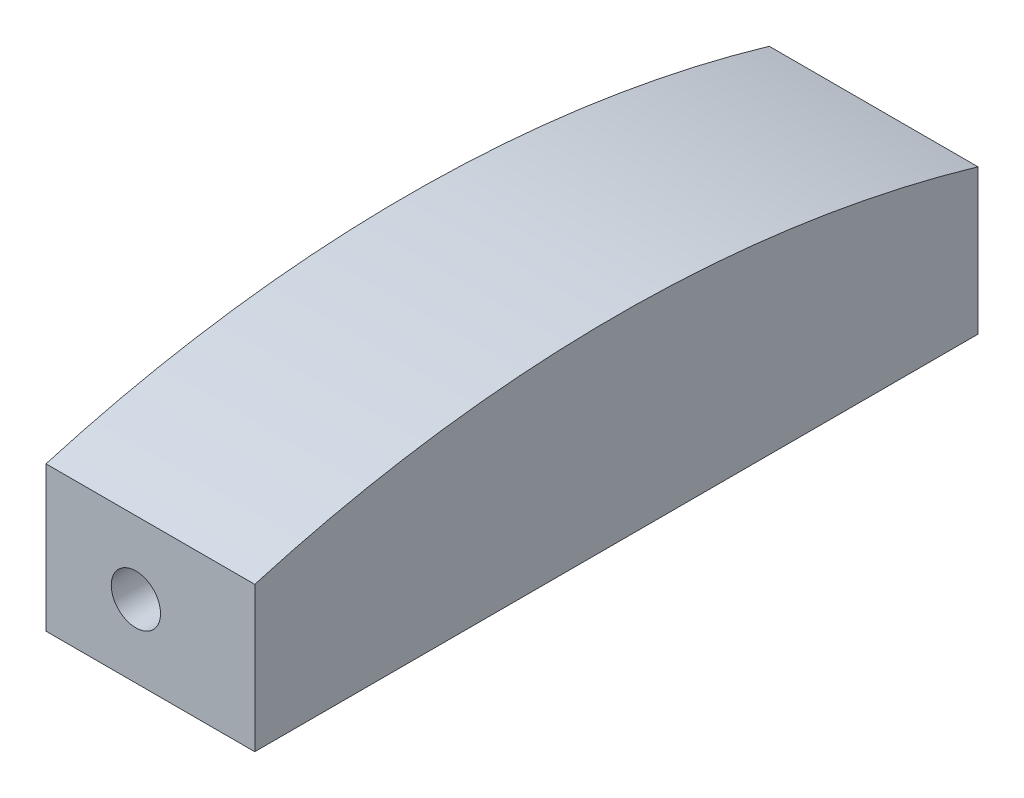
ISO-10303-21;
HEADER;
FILE_DESCRIPTION(('STEP AP214'),'2;1');
FILE_NAME('part.step','',(''),(''),'','','');
FILE_SCHEMA(('AUTOMOTIVE_DESIGN { 1 0 10303 214 1 1 1 1 }'));
ENDSEC;
DATA;
#1=APPLICATION_CONTEXT('core data for automotive mechanical design processes');
#2=APPLICATION_PROTOCOL_DEFINITION('international standard','automotive_design',2000,#1);
#3=PRODUCT_CONTEXT('',#1,'mechanical');
#4=PRODUCT('Part','Part','',(#3));
#5=PRODUCT_RELATED_PRODUCT_CATEGORY('part','',(#4));
#6=PRODUCT_DEFINITION_FORMATION('','',#4);
#7=PRODUCT_DEFINITION_CONTEXT('part definition',#1,'design');
#8=PRODUCT_DEFINITION('design','',#6,#7);
#9=PRODUCT_DEFINITION_SHAPE('','',#8);
#10=(LENGTH_UNIT() NAMED_UNIT(*) SI_UNIT(.MILLI.,.METRE.));
#11=(NAMED_UNIT(*) PLANE_ANGLE_UNIT() SI_UNIT($,.RADIAN.));
#12=(NAMED_UNIT(*) SI_UNIT($,.STERADIAN.) SOLID_ANGLE_UNIT());
#13=UNCERTAINTY_MEASURE_WITH_UNIT(LENGTH_MEASURE(1.E-05),#10,'distance_accuracy_value','');
#14=(GEOMETRIC_REPRESENTATION_CONTEXT(3) GLOBAL_UNCERTAINTY_ASSIGNED_CONTEXT((#13)) GLOBAL_UNIT_ASSIGNED_CONTEXT((#10,
#11,#12)) REPRESENTATION_CONTEXT('',''));
#15=CARTESIAN_POINT('',(0.,0.,0.));
#16=DIRECTION('',(0.,0.,1.));
#17=DIRECTION('',(1.,0.,0.));
#18=AXIS2_PLACEMENT_3D('',#15,#16,#17);
#19=CARTESIAN_POINT('',(0.,0.,0.));
#20=DIRECTION('',(0.,-1.,0.));
#21=DIRECTION('',(0.,0.,-1.));
#22=AXIS2_PLACEMENT_3D('',#19,#20,#21);
#23=PLANE('',#22);
#24=DIRECTION('',(0.,0.,1.));
#25=VECTOR('',#24,1.);
#26=CARTESIAN_POINT('',(0.,0.,0.));
#27=LINE('',#26,#25);
#28=CARTESIAN_POINT('',(0.,0.,-63.3570223198417));
#29=VERTEX_POINT('',#28);
#30=CARTESIAN_POINT('',(0.,0.,0.));
#31=VERTEX_POINT('',#30);
#32=EDGE_CURVE('E175',#29,#31,#27,.T.);
#33=ORIENTED_EDGE('',*,*,#32,.F.);
#34=DIRECTION('',(-1.,0.,0.));
#35=VECTOR('',#34,1.);
#36=CARTESIAN_POINT('',(0.,0.,-63.3570223198417));
#37=LINE('',#36,#35);
#38=CARTESIAN_POINT('',(18.288,0.,-63.3570223198417));
#39=VERTEX_POINT('',#38);
#40=EDGE_CURVE('E151',#39,#29,#37,.T.);
#41=ORIENTED_EDGE('',*,*,#40,.F.);
#42=DIRECTION('',(0.,0.,-1.));
#43=VECTOR('',#42,1.);
#44=CARTESIAN_POINT('',(18.288,0.,0.));
#45=LINE('',#44,#43);
#46=CARTESIAN_POINT('',(18.288,0.,0.));
#47=VERTEX_POINT('',#46);
#48=EDGE_CURVE('E182',#47,#39,#45,.T.);
#49=ORIENTED_EDGE('',*,*,#48,.F.);
#50=DIRECTION('',(1.,0.,0.));
#51=VECTOR('',#50,1.);
#52=CARTESIAN_POINT('',(0.,0.,0.));
#53=LINE('',#52,#51);
#54=EDGE_CURVE('E178',#31,#47,#53,.T.);
#55=ORIENTED_EDGE('',*,*,#54,.F.);
#56=EDGE_LOOP('',(#33,#41,#49,#55));
#57=FACE_BOUND('',#56,.T.);
#58=DIRECTION('',(-1.,0.,0.));
#59=VECTOR('',#58,1.);
#60=CARTESIAN_POINT('',(2.794,0.,-58.2770223198416));
#61=LINE('',#60,#59);
#62=CARTESIAN_POINT('',(12.954,0.,-58.2770223198416));
#63=VERTEX_POINT('',#62);
#64=CARTESIAN_POINT('',(2.794,0.,-58.2770223198416));
#65=VERTEX_POINT('',#64);
#66=EDGE_CURVE('E266',#63,#65,#61,.T.);
#67=ORIENTED_EDGE('',*,*,#66,.T.);
#68=DIRECTION('',(0.,0.,1.));
#69=VECTOR('',#68,1.);
#70=CARTESIAN_POINT('',(2.794,0.,-58.2770223198416));
#71=LINE('',#70,#69);
#72=CARTESIAN_POINT('',(2.794,0.,-53.1970223198417));
#73=VERTEX_POINT('',#72);
#74=EDGE_CURVE('E73',#65,#73,#71,.T.);
#75=ORIENTED_EDGE('',*,*,#74,.T.);
#76=DIRECTION('',(1.,0.,0.));
#77=VECTOR('',#76,1.);
#78=CARTESIAN_POINT('',(2.794,0.,-53.1970223198417));
#79=LINE('',#78,#77);
#80=CARTESIAN_POINT('',(12.954,0.,-53.1970223198417));
#81=VERTEX_POINT('',#80);
#82=EDGE_CURVE('E281',#73,#81,#79,.T.);
#83=ORIENTED_EDGE('',*,*,#82,.T.);
#84=DIRECTION('',(0.,0.,-1.));
#85=VECTOR('',#84,1.);
#86=CARTESIAN_POINT('',(12.954,0.,-58.2770223198416));
#87=LINE('',#86,#85);
#88=EDGE_CURVE('E285',#81,#63,#87,.T.);
#89=ORIENTED_EDGE('',*,*,#88,.T.);
#90=EDGE_LOOP('',(#67,#75,#83,#89));
#91=FACE_BOUND('',#90,.T.);
#92=DIRECTION('',(-1.,0.,0.));
#93=VECTOR('',#92,1.);
#94=CARTESIAN_POINT('',(2.794,0.,-10.16));
#95=LINE('',#94,#93);
#96=CARTESIAN_POINT('',(12.954,0.,-10.16));
#97=VERTEX_POINT('',#96);
#98=CARTESIAN_POINT('',(2.794,0.,-10.16));
#99=VERTEX_POINT('',#98);
#100=EDGE_CURVE('E224',#97,#99,#95,.T.);
#101=ORIENTED_EDGE('',*,*,#100,.T.);
#102=DIRECTION('',(0.,0.,1.));
#103=VECTOR('',#102,1.);
#104=CARTESIAN_POINT('',(2.794,0.,-10.16));
#105=LINE('',#104,#103);
#106=CARTESIAN_POINT('',(2.794,0.,-5.08));
#107=VERTEX_POINT('',#106);
#108=EDGE_CURVE('E65',#99,#107,#105,.T.);
#109=ORIENTED_EDGE('',*,*,#108,.T.);
#110=DIRECTION('',(1.,0.,0.));
#111=VECTOR('',#110,1.);
#112=CARTESIAN_POINT('',(2.794,0.,-5.08));
#113=LINE('',#112,#111);
#114=CARTESIAN_POINT('',(12.954,0.,-5.08));
#115=VERTEX_POINT('',#114);
#116=EDGE_CURVE('E239',#107,#115,#113,.T.);
#117=ORIENTED_EDGE('',*,*,#116,.T.);
#118=DIRECTION('',(0.,0.,-1.));
#119=VECTOR('',#118,1.);
#120=CARTESIAN_POINT('',(12.954,0.,-10.16));
#121=LINE('',#120,#119);
#122=EDGE_CURVE('E243',#115,#97,#121,.T.);
#123=ORIENTED_EDGE('',*,*,#122,.T.);
#124=EDGE_LOOP('',(#101,#109,#117,#123));
#125=FACE_BOUND('',#124,.T.);
#126=ADVANCED_FACE('F47',(#57,#91,#125),#23,.T.);
#127=CARTESIAN_POINT('',(0.,12.7,0.));
#128=DIRECTION('',(1.,0.,0.));
#129=DIRECTION('',(0.,0.,-1.));
#130=AXIS2_PLACEMENT_3D('',#127,#128,#129);
#131=PLANE('',#130);
#132=ORIENTED_EDGE('',*,*,#32,.T.);
#133=DIRECTION('',(0.,-1.,0.));
#134=VECTOR('',#133,1.);
#135=CARTESIAN_POINT('',(0.,12.7,0.));
#136=LINE('',#135,#134);
#137=CARTESIAN_POINT('',(0.,12.7,0.));
#138=VERTEX_POINT('',#137);
#139=EDGE_CURVE('E11',#138,#31,#136,.T.);
#140=ORIENTED_EDGE('',*,*,#139,.F.);
#141=CARTESIAN_POINT('',(0.,-95.6140746667847,-31.6785111599208));
#142=DIRECTION('',(1.,0.,0.));
#143=DIRECTION('',(0.,0.,-1.));
#144=AXIS2_PLACEMENT_3D('',#141,#142,#143);
#145=CIRCLE('',#144,112.851525644233);
#146=CARTESIAN_POINT('',(0.,12.7,-63.3570223198417));
#147=VERTEX_POINT('',#146);
#148=EDGE_CURVE('E160',#138,#147,#145,.F.);
#149=ORIENTED_EDGE('',*,*,#148,.T.);
#150=DIRECTION('',(0.,-1.,0.));
#151=VECTOR('',#150,1.);
#152=CARTESIAN_POINT('',(0.,12.7,-63.3570223198417));
#153=LINE('',#152,#151);
#154=EDGE_CURVE('E143',#147,#29,#153,.T.);
#155=ORIENTED_EDGE('',*,*,#154,.T.);
#156=EDGE_LOOP('',(#132,#140,#149,#155));
#157=FACE_BOUND('',#156,.T.);
#158=ADVANCED_FACE('F49',(#157),#131,.F.);
#159=CARTESIAN_POINT('',(0.,12.7,0.));
#160=DIRECTION('',(0.,0.,-1.));
#161=DIRECTION('',(-1.,0.,0.));
#162=AXIS2_PLACEMENT_3D('',#159,#160,#161);
#163=PLANE('',#162);
#164=CARTESIAN_POINT('',(7.874,6.35,0.));
#165=DIRECTION('',(0.,0.,-1.));
#166=DIRECTION('',(-1.,0.,0.));
#167=AXIS2_PLACEMENT_3D('',#164,#165,#166);
#168=CIRCLE('',#167,2.159);
#169=CARTESIAN_POINT('',(5.715,6.35,0.));
#170=VERTEX_POINT('',#169);
#171=EDGE_CURVE('E192',#170,#170,#168,.F.);
#172=ORIENTED_EDGE('',*,*,#171,.F.);
#173=EDGE_LOOP('',(#172));
#174=FACE_BOUND('',#173,.T.);
#175=ORIENTED_EDGE('',*,*,#54,.T.);
#176=DIRECTION('',(0.,-1.,0.));
#177=VECTOR('',#176,1.);
#178=CARTESIAN_POINT('',(18.288,12.7,0.));
#179=LINE('',#178,#177);
#180=CARTESIAN_POINT('',(18.288,12.7,0.));
#181=VERTEX_POINT('',#180);
#182=EDGE_CURVE('E57',#181,#47,#179,.T.);
#183=ORIENTED_EDGE('',*,*,#182,.F.);
#184=DIRECTION('',(1.,0.,0.));
#185=VECTOR('',#184,1.);
#186=CARTESIAN_POINT('',(0.,12.7,0.));
#187=LINE('',#186,#185);
#188=EDGE_CURVE('E169',#138,#181,#187,.T.);
#189=ORIENTED_EDGE('',*,*,#188,.F.);
#190=ORIENTED_EDGE('',*,*,#139,.T.);
#191=EDGE_LOOP('',(#175,#183,#189,#190));
#192=FACE_BOUND('',#191,.T.);
#193=ADVANCED_FACE('F335',(#174,#192),#163,.F.);
#194=CARTESIAN_POINT('',(18.288,12.7,0.));
#195=DIRECTION('',(-1.,0.,0.));
#196=DIRECTION('',(0.,0.,1.));
#197=AXIS2_PLACEMENT_3D('',#194,#195,#196);
#198=PLANE('',#197);
#199=ORIENTED_EDGE('',*,*,#48,.T.);
#200=DIRECTION('',(0.,-1.,0.));
#201=VECTOR('',#200,1.);
#202=CARTESIAN_POINT('',(18.288,12.7,-63.3570223198417));
#203=LINE('',#202,#201);
#204=CARTESIAN_POINT('',(18.288,12.7,-63.3570223198417));
#205=VERTEX_POINT('',#204);
#206=EDGE_CURVE('E156',#205,#39,#203,.T.);
#207=ORIENTED_EDGE('',*,*,#206,.F.);
#208=CARTESIAN_POINT('',(18.288,-95.6140746667847,-31.6785111599208));
#209=DIRECTION('',(1.,0.,0.));
#210=DIRECTION('',(0.,0.,1.));
#211=AXIS2_PLACEMENT_3D('',#208,#209,#210);
#212=CIRCLE('',#211,112.851525644233);
#213=EDGE_CURVE('E164',#205,#181,#212,.T.);
#214=ORIENTED_EDGE('',*,*,#213,.T.);
#215=ORIENTED_EDGE('',*,*,#182,.T.);
#216=EDGE_LOOP('',(#199,#207,#214,#215));
#217=FACE_BOUND('',#216,.T.);
#218=ADVANCED_FACE('F340',(#217),#198,.F.);
#219=CARTESIAN_POINT('',(0.,12.7,-63.3570223198417));
#220=DIRECTION('',(0.,0.,1.));
#221=DIRECTION('',(1.,0.,0.));
#222=AXIS2_PLACEMENT_3D('',#219,#220,#221);
#223=PLANE('',#222);
#224=CARTESIAN_POINT('',(8.128,6.35,-63.3570223198417));
#225=DIRECTION('',(0.,0.,1.));
#226=DIRECTION('',(1.,0.,0.));
#227=AXIS2_PLACEMENT_3D('',#224,#225,#226);
#228=CIRCLE('',#227,2.159);
#229=CARTESIAN_POINT('',(10.287,6.35,-63.3570223198417));
#230=VERTEX_POINT('',#229);
#231=EDGE_CURVE('E196',#230,#230,#228,.F.);
#232=ORIENTED_EDGE('',*,*,#231,.F.);
#233=EDGE_LOOP('',(#232));
#234=FACE_BOUND('',#233,.T.);
#235=ORIENTED_EDGE('',*,*,#40,.T.);
#236=ORIENTED_EDGE('',*,*,#154,.F.);
#237=DIRECTION('',(-1.,0.,0.));
#238=VECTOR('',#237,1.);
#239=CARTESIAN_POINT('',(0.,12.7,-63.3570223198417));
#240=LINE('',#239,#238);
#241=EDGE_CURVE('E148',#205,#147,#240,.T.);
#242=ORIENTED_EDGE('',*,*,#241,.F.);
#243=ORIENTED_EDGE('',*,*,#206,.T.);
#244=EDGE_LOOP('',(#235,#236,#242,#243));
#245=FACE_BOUND('',#244,.T.);
#246=ADVANCED_FACE('F145',(#234,#245),#223,.F.);
#247=CARTESIAN_POINT('',(2.794,12.7,-58.2770223198416));
#248=DIRECTION('',(1.,0.,0.));
#249=DIRECTION('',(0.,0.,-1.));
#250=AXIS2_PLACEMENT_3D('',#247,#248,#249);
#251=PLANE('',#250);
#252=ORIENTED_EDGE('',*,*,#74,.F.);
#253=DIRECTION('',(0.,-1.,0.));
#254=VECTOR('',#253,1.);
#255=CARTESIAN_POINT('',(2.794,12.7,-58.2770223198416));
#256=LINE('',#255,#254);
#257=CARTESIAN_POINT('',(2.794,12.7,-58.2770223198416));
#258=VERTEX_POINT('',#257);
#259=EDGE_CURVE('E278',#258,#65,#256,.T.);
#260=ORIENTED_EDGE('',*,*,#259,.F.);
#261=DIRECTION('',(0.,0.,1.));
#262=VECTOR('',#261,1.);
#263=CARTESIAN_POINT('',(2.794,12.7,-58.2770223198416));
#264=LINE('',#263,#262);
#265=CARTESIAN_POINT('',(2.794,12.7,-53.1970223198417));
#266=VERTEX_POINT('',#265);
#267=EDGE_CURVE('E261',#258,#266,#264,.T.);
#268=ORIENTED_EDGE('',*,*,#267,.T.);
#269=DIRECTION('',(0.,-1.,0.));
#270=VECTOR('',#269,1.);
#271=CARTESIAN_POINT('',(2.794,12.7,-53.1970223198417));
#272=LINE('',#271,#270);
#273=EDGE_CURVE('E179',#266,#73,#272,.T.);
#274=ORIENTED_EDGE('',*,*,#273,.T.);
#275=EDGE_LOOP('',(#252,#260,#268,#274));
#276=FACE_BOUND('',#275,.T.);
#277=ADVANCED_FACE('F301',(#276),#251,.T.);
#278=CARTESIAN_POINT('',(2.794,12.7,-53.1970223198417));
#279=DIRECTION('',(0.,0.,-1.));
#280=DIRECTION('',(-1.,0.,0.));
#281=AXIS2_PLACEMENT_3D('',#278,#279,#280);
#282=PLANE('',#281);
#283=CARTESIAN_POINT('',(8.128,6.35,-53.1970223198417));
#284=DIRECTION('',(0.,0.,-1.));
#285=DIRECTION('',(-1.,0.,0.));
#286=AXIS2_PLACEMENT_3D('',#283,#284,#285);
#287=CIRCLE('',#286,1.778);
#288=CARTESIAN_POINT('',(6.35,6.35,-53.1970223198417));
#289=VERTEX_POINT('',#288);
#290=EDGE_CURVE('E207',#289,#289,#287,.T.);
#291=ORIENTED_EDGE('',*,*,#290,.F.);
#292=EDGE_LOOP('',(#291));
#293=FACE_BOUND('',#292,.T.);
#294=ORIENTED_EDGE('',*,*,#82,.F.);
#295=ORIENTED_EDGE('',*,*,#273,.F.);
#296=DIRECTION('',(1.,0.,0.));
#297=VECTOR('',#296,1.);
#298=CARTESIAN_POINT('',(2.794,12.7,-53.1970223198417));
#299=LINE('',#298,#297);
#300=CARTESIAN_POINT('',(12.954,12.7,-53.1970223198417));
#301=VERTEX_POINT('',#300);
#302=EDGE_CURVE('E265',#266,#301,#299,.T.);
#303=ORIENTED_EDGE('',*,*,#302,.T.);
#304=DIRECTION('',(0.,-1.,0.));
#305=VECTOR('',#304,1.);
#306=CARTESIAN_POINT('',(12.954,12.7,-53.1970223198417));
#307=LINE('',#306,#305);
#308=EDGE_CURVE('E297',#301,#81,#307,.T.);
#309=ORIENTED_EDGE('',*,*,#308,.T.);
#310=EDGE_LOOP('',(#294,#295,#303,#309));
#311=FACE_BOUND('',#310,.T.);
#312=ADVANCED_FACE('F313',(#293,#311),#282,.T.);
#313=CARTESIAN_POINT('',(12.954,12.7,-58.2770223198416));
#314=DIRECTION('',(-1.,0.,0.));
#315=DIRECTION('',(0.,0.,1.));
#316=AXIS2_PLACEMENT_3D('',#313,#314,#315);
#317=PLANE('',#316);
#318=ORIENTED_EDGE('',*,*,#88,.F.);
#319=ORIENTED_EDGE('',*,*,#308,.F.);
#320=DIRECTION('',(0.,0.,-1.));
#321=VECTOR('',#320,1.);
#322=CARTESIAN_POINT('',(12.954,12.7,-58.2770223198416));
#323=LINE('',#322,#321);
#324=CARTESIAN_POINT('',(12.954,12.7,-58.2770223198416));
#325=VERTEX_POINT('',#324);
#326=EDGE_CURVE('E270',#301,#325,#323,.T.);
#327=ORIENTED_EDGE('',*,*,#326,.T.);
#328=DIRECTION('',(0.,-1.,0.));
#329=VECTOR('',#328,1.);
#330=CARTESIAN_POINT('',(12.954,12.7,-58.2770223198416));
#331=LINE('',#330,#329);
#332=EDGE_CURVE('E294',#325,#63,#331,.T.);
#333=ORIENTED_EDGE('',*,*,#332,.T.);
#334=EDGE_LOOP('',(#318,#319,#327,#333));
#335=FACE_BOUND('',#334,.T.);
#336=ADVANCED_FACE('F315',(#335),#317,.T.);
#337=CARTESIAN_POINT('',(2.794,12.7,-58.2770223198416));
#338=DIRECTION('',(0.,0.,1.));
#339=DIRECTION('',(1.,0.,0.));
#340=AXIS2_PLACEMENT_3D('',#337,#338,#339);
#341=PLANE('',#340);
#342=CARTESIAN_POINT('',(8.128,6.35,-58.2770223198416));
#343=DIRECTION('',(0.,0.,1.));
#344=DIRECTION('',(1.,0.,0.));
#345=AXIS2_PLACEMENT_3D('',#342,#343,#344);
#346=CIRCLE('',#345,1.778);
#347=CARTESIAN_POINT('',(9.906,6.35,-58.2770223198416));
#348=VERTEX_POINT('',#347);
#349=EDGE_CURVE('E213',#348,#348,#346,.T.);
#350=ORIENTED_EDGE('',*,*,#349,.F.);
#351=EDGE_LOOP('',(#350));
#352=FACE_BOUND('',#351,.T.);
#353=ORIENTED_EDGE('',*,*,#66,.F.);
#354=ORIENTED_EDGE('',*,*,#332,.F.);
#355=DIRECTION('',(-1.,0.,0.));
#356=VECTOR('',#355,1.);
#357=CARTESIAN_POINT('',(2.794,12.7,-58.2770223198416));
#358=LINE('',#357,#356);
#359=EDGE_CURVE('E274',#325,#258,#358,.T.);
#360=ORIENTED_EDGE('',*,*,#359,.T.);
#361=ORIENTED_EDGE('',*,*,#259,.T.);
#362=EDGE_LOOP('',(#353,#354,#360,#361));
#363=FACE_BOUND('',#362,.T.);
#364=ADVANCED_FACE('F309',(#352,#363),#341,.T.);
#365=CARTESIAN_POINT('',(2.794,12.7,-10.16));
#366=DIRECTION('',(1.,0.,0.));
#367=DIRECTION('',(0.,0.,-1.));
#368=AXIS2_PLACEMENT_3D('',#365,#366,#367);
#369=PLANE('',#368);
#370=ORIENTED_EDGE('',*,*,#108,.F.);
#371=DIRECTION('',(0.,-1.,0.));
#372=VECTOR('',#371,1.);
#373=CARTESIAN_POINT('',(2.794,12.7,-10.16));
#374=LINE('',#373,#372);
#375=CARTESIAN_POINT('',(2.794,12.7,-10.16));
#376=VERTEX_POINT('',#375);
#377=EDGE_CURVE('E236',#376,#99,#374,.T.);
#378=ORIENTED_EDGE('',*,*,#377,.F.);
#379=DIRECTION('',(0.,0.,1.));
#380=VECTOR('',#379,1.);
#381=CARTESIAN_POINT('',(2.794,12.7,-10.16));
#382=LINE('',#381,#380);
#383=CARTESIAN_POINT('',(2.794,12.7,-5.08));
#384=VERTEX_POINT('',#383);
#385=EDGE_CURVE('E219',#376,#384,#382,.T.);
#386=ORIENTED_EDGE('',*,*,#385,.T.);
#387=DIRECTION('',(0.,-1.,0.));
#388=VECTOR('',#387,1.);
#389=CARTESIAN_POINT('',(2.794,12.7,-5.08));
#390=LINE('',#389,#388);
#391=EDGE_CURVE('E258',#384,#107,#390,.T.);
#392=ORIENTED_EDGE('',*,*,#391,.T.);
#393=EDGE_LOOP('',(#370,#378,#386,#392));
#394=FACE_BOUND('',#393,.T.);
#395=ADVANCED_FACE('F323',(#394),#369,.T.);
#396=CARTESIAN_POINT('',(2.794,12.7,-5.08));
#397=DIRECTION('',(0.,0.,-1.));
#398=DIRECTION('',(-1.,0.,0.));
#399=AXIS2_PLACEMENT_3D('',#396,#397,#398);
#400=PLANE('',#399);
#401=CARTESIAN_POINT('',(8.128,6.35,-5.08));
#402=DIRECTION('',(0.,0.,-1.));
#403=DIRECTION('',(-1.,0.,0.));
#404=AXIS2_PLACEMENT_3D('',#401,#402,#403);
#405=CIRCLE('',#404,1.778);
#406=CARTESIAN_POINT('',(6.35,6.35,-5.08));
#407=VERTEX_POINT('',#406);
#408=EDGE_CURVE('E477',#407,#407,#405,.T.);
#409=ORIENTED_EDGE('',*,*,#408,.F.);
#410=EDGE_LOOP('',(#409));
#411=FACE_BOUND('',#410,.T.);
#412=ORIENTED_EDGE('',*,*,#116,.F.);
#413=ORIENTED_EDGE('',*,*,#391,.F.);
#414=DIRECTION('',(1.,0.,0.));
#415=VECTOR('',#414,1.);
#416=CARTESIAN_POINT('',(2.794,12.7,-5.08));
#417=LINE('',#416,#415);
#418=CARTESIAN_POINT('',(12.954,12.7,-5.08));
#419=VERTEX_POINT('',#418);
#420=EDGE_CURVE('E223',#384,#419,#417,.T.);
#421=ORIENTED_EDGE('',*,*,#420,.T.);
#422=DIRECTION('',(0.,-1.,0.));
#423=VECTOR('',#422,1.);
#424=CARTESIAN_POINT('',(12.954,12.7,-5.08));
#425=LINE('',#424,#423);
#426=EDGE_CURVE('E255',#419,#115,#425,.T.);
#427=ORIENTED_EDGE('',*,*,#426,.T.);
#428=EDGE_LOOP('',(#412,#413,#421,#427));
#429=FACE_BOUND('',#428,.T.);
#430=ADVANCED_FACE('F379',(#411,#429),#400,.T.);
#431=CARTESIAN_POINT('',(12.954,12.7,-10.16));
#432=DIRECTION('',(-1.,0.,0.));
#433=DIRECTION('',(0.,0.,1.));
#434=AXIS2_PLACEMENT_3D('',#431,#432,#433);
#435=PLANE('',#434);
#436=ORIENTED_EDGE('',*,*,#122,.F.);
#437=ORIENTED_EDGE('',*,*,#426,.F.);
#438=DIRECTION('',(0.,0.,-1.));
#439=VECTOR('',#438,1.);
#440=CARTESIAN_POINT('',(12.954,12.7,-10.16));
#441=LINE('',#440,#439);
#442=CARTESIAN_POINT('',(12.954,12.7,-10.16));
#443=VERTEX_POINT('',#442);
#444=EDGE_CURVE('E228',#419,#443,#441,.T.);
#445=ORIENTED_EDGE('',*,*,#444,.T.);
#446=DIRECTION('',(0.,-1.,0.));
#447=VECTOR('',#446,1.);
#448=CARTESIAN_POINT('',(12.954,12.7,-10.16));
#449=LINE('',#448,#447);
#450=EDGE_CURVE('E252',#443,#97,#449,.T.);
#451=ORIENTED_EDGE('',*,*,#450,.T.);
#452=EDGE_LOOP('',(#436,#437,#445,#451));
#453=FACE_BOUND('',#452,.T.);
#454=ADVANCED_FACE('F375',(#453),#435,.T.);
#455=CARTESIAN_POINT('',(2.794,12.7,-10.16));
#456=DIRECTION('',(0.,0.,1.));
#457=DIRECTION('',(1.,0.,0.));
#458=AXIS2_PLACEMENT_3D('',#455,#456,#457);
#459=PLANE('',#458);
#460=CARTESIAN_POINT('',(8.128,6.35,-10.16));
#461=DIRECTION('',(0.,0.,1.));
#462=DIRECTION('',(1.,0.,0.));
#463=AXIS2_PLACEMENT_3D('',#460,#461,#462);
#464=CIRCLE('',#463,1.778);
#465=CARTESIAN_POINT('',(6.35,6.35,-10.16));
#466=VERTEX_POINT('',#465);
#467=EDGE_CURVE('E475',#466,#466,#464,.T.);
#468=ORIENTED_EDGE('',*,*,#467,.F.);
#469=EDGE_LOOP('',(#468));
#470=FACE_BOUND('',#469,.T.);
#471=ORIENTED_EDGE('',*,*,#100,.F.);
#472=ORIENTED_EDGE('',*,*,#450,.F.);
#473=DIRECTION('',(-1.,0.,0.));
#474=VECTOR('',#473,1.);
#475=CARTESIAN_POINT('',(2.794,12.7,-10.16));
#476=LINE('',#475,#474);
#477=EDGE_CURVE('E232',#443,#376,#476,.T.);
#478=ORIENTED_EDGE('',*,*,#477,.T.);
#479=ORIENTED_EDGE('',*,*,#377,.T.);
#480=EDGE_LOOP('',(#471,#472,#478,#479));
#481=FACE_BOUND('',#480,.T.);
#482=ADVANCED_FACE('F370',(#470,#481),#459,.T.);
#483=CARTESIAN_POINT('',(-63.5192942231702,12.7,0.));
#484=DIRECTION('',(0.,-1.,0.));
#485=DIRECTION('',(0.,0.,-1.));
#486=AXIS2_PLACEMENT_3D('',#483,#484,#485);
#487=PLANE('',#486);
#488=ORIENTED_EDGE('',*,*,#420,.F.);
#489=ORIENTED_EDGE('',*,*,#385,.F.);
#490=ORIENTED_EDGE('',*,*,#477,.F.);
#491=ORIENTED_EDGE('',*,*,#444,.F.);
#492=EDGE_LOOP('',(#488,#489,#490,#491));
#493=FACE_BOUND('',#492,.T.);
#494=ADVANCED_FACE('F368',(#493),#487,.T.);
#495=ORIENTED_EDGE('',*,*,#302,.F.);
#496=ORIENTED_EDGE('',*,*,#267,.F.);
#497=ORIENTED_EDGE('',*,*,#359,.F.);
#498=ORIENTED_EDGE('',*,*,#326,.F.);
#499=EDGE_LOOP('',(#495,#496,#497,#498));
#500=FACE_BOUND('',#499,.T.);
#501=ADVANCED_FACE('F311',(#500),#487,.T.);
#502=CARTESIAN_POINT('',(-63.5192942231702,-95.6140746667847,-31.6785111599208));
#503=DIRECTION('',(1.,0.,0.));
#504=DIRECTION('',(0.,0.,-1.));
#505=AXIS2_PLACEMENT_3D('',#502,#503,#504);
#506=CYLINDRICAL_SURFACE('',#505,112.851525644233);
#507=ORIENTED_EDGE('',*,*,#148,.F.);
#508=ORIENTED_EDGE('',*,*,#188,.T.);
#509=ORIENTED_EDGE('',*,*,#213,.F.);
#510=ORIENTED_EDGE('',*,*,#241,.T.);
#511=EDGE_LOOP('',(#507,#508,#509,#510));
#512=FACE_BOUND('',#511,.T.);
#513=ADVANCED_FACE('F166',(#512),#506,.T.);
#514=CARTESIAN_POINT('',(7.874,6.35,1.2E-05));
#515=DIRECTION('',(0.,0.,-1.));
#516=DIRECTION('',(-1.,0.,0.));
#517=AXIS2_PLACEMENT_3D('',#514,#515,#516);
#518=CYLINDRICAL_SURFACE('',#517,2.159);
#519=CARTESIAN_POINT('',(7.874,6.35,-3.81));
#520=DIRECTION('',(0.,0.,1.));
#521=DIRECTION('',(1.,0.,0.));
#522=AXIS2_PLACEMENT_3D('',#519,#520,#521);
#523=CIRCLE('',#522,2.159);
#524=CARTESIAN_POINT('',(5.715,6.35,-3.81));
#525=VERTEX_POINT('',#524);
#526=EDGE_CURVE('E195',#525,#525,#523,.T.);
#527=CARTESIAN_POINT('',(5.715,6.35,-3.81));
#528=CARTESIAN_POINT('',(5.715,6.35,-3.7703125));
#529=CARTESIAN_POINT('',(5.715,6.35,-3.730625));
#530=CARTESIAN_POINT('',(5.715,6.35,-3.65125));
#531=CARTESIAN_POINT('',(5.715,6.35,-3.6115625));
#532=CARTESIAN_POINT('',(5.715,6.35,-3.5321875));
#533=CARTESIAN_POINT('',(5.715,6.35,-3.4925));
#534=CARTESIAN_POINT('',(5.715,6.35,-3.413125));
#535=CARTESIAN_POINT('',(5.715,6.35,-3.3734375));
#536=CARTESIAN_POINT('',(5.715,6.35,-3.2940625));
#537=CARTESIAN_POINT('',(5.715,6.35,-3.254375));
#538=CARTESIAN_POINT('',(5.715,6.35,-3.175));
#539=CARTESIAN_POINT('',(5.715,6.35,-3.1353125));
#540=CARTESIAN_POINT('',(5.715,6.35,-3.0559375));
#541=CARTESIAN_POINT('',(5.715,6.35,-3.01625));
#542=CARTESIAN_POINT('',(5.715,6.35,-2.936875));
#543=CARTESIAN_POINT('',(5.715,6.35,-2.8971875));
#544=CARTESIAN_POINT('',(5.715,6.35,-2.8178125));
#545=CARTESIAN_POINT('',(5.715,6.35,-2.778125));
#546=CARTESIAN_POINT('',(5.715,6.35,-2.69875));
#547=CARTESIAN_POINT('',(5.715,6.35,-2.6590625));
#548=CARTESIAN_POINT('',(5.715,6.35,-2.5796875));
#549=CARTESIAN_POINT('',(5.715,6.35,-2.54));
#550=CARTESIAN_POINT('',(5.715,6.35,-2.460625));
#551=CARTESIAN_POINT('',(5.715,6.35,-2.4209375));
#552=CARTESIAN_POINT('',(5.715,6.35,-2.3415625));
#553=CARTESIAN_POINT('',(5.715,6.35,-2.301875));
#554=CARTESIAN_POINT('',(5.715,6.35,-2.2225));
#555=CARTESIAN_POINT('',(5.715,6.35,-2.1828125));
#556=CARTESIAN_POINT('',(5.715,6.35,-2.1034375));
#557=CARTESIAN_POINT('',(5.715,6.35,-2.06375));
#558=CARTESIAN_POINT('',(5.715,6.35,-1.984375));
#559=CARTESIAN_POINT('',(5.715,6.35,-1.9446875));
#560=CARTESIAN_POINT('',(5.715,6.35,-1.8653125));
#561=CARTESIAN_POINT('',(5.715,6.35,-1.825625));
#562=CARTESIAN_POINT('',(5.715,6.35,-1.74625));
#563=CARTESIAN_POINT('',(5.715,6.35,-1.7065625));
#564=CARTESIAN_POINT('',(5.715,6.35,-1.6271875));
#565=CARTESIAN_POINT('',(5.715,6.35,-1.5875));
#566=CARTESIAN_POINT('',(5.715,6.35,-1.508125));
#567=CARTESIAN_POINT('',(5.715,6.35,-1.4684375));
#568=CARTESIAN_POINT('',(5.715,6.35,-1.3890625));
#569=CARTESIAN_POINT('',(5.715,6.35,-1.349375));
#570=CARTESIAN_POINT('',(5.715,6.35,-1.27));
#571=CARTESIAN_POINT('',(5.715,6.35,-1.2303125));
#572=CARTESIAN_POINT('',(5.715,6.35,-1.1509375));
#573=CARTESIAN_POINT('',(5.715,6.35,-1.11125));
#574=CARTESIAN_POINT('',(5.715,6.35,-1.031875));
#575=CARTESIAN_POINT('',(5.715,6.35,-0.9921875));
#576=CARTESIAN_POINT('',(5.715,6.35,-0.9128125));
#577=CARTESIAN_POINT('',(5.715,6.35,-0.873125));
#578=CARTESIAN_POINT('',(5.715,6.35,-0.79375));
#579=CARTESIAN_POINT('',(5.715,6.35,-0.7540625));
#580=CARTESIAN_POINT('',(5.715,6.35,-0.6746875));
#581=CARTESIAN_POINT('',(5.715,6.35,-0.635));
#582=CARTESIAN_POINT('',(5.715,6.35,-0.555625));
#583=CARTESIAN_POINT('',(5.715,6.35,-0.5159375));
#584=CARTESIAN_POINT('',(5.715,6.35,-0.4365625));
#585=CARTESIAN_POINT('',(5.715,6.35,-0.396875));
#586=CARTESIAN_POINT('',(5.715,6.35,-0.3175));
#587=CARTESIAN_POINT('',(5.715,6.35,-0.2778125));
#588=CARTESIAN_POINT('',(5.715,6.35,-0.1984375));
#589=CARTESIAN_POINT('',(5.715,6.35,-0.15875));
#590=CARTESIAN_POINT('',(5.715,6.35,-0.079375));
#591=CARTESIAN_POINT('',(5.715,6.35,-0.0396875000000001));
#592=CARTESIAN_POINT('',(5.715,6.35,0.));
#593=B_SPLINE_CURVE_WITH_KNOTS('',3,(#527,#528,#529,#530,#531,#532,#533,#534,#535,#536,#537,
#538,#539,#540,#541,#542,#543,#544,#545,#546,#547,#548,#549,#550,#551,#552,#553,#554,#555,#556,
#557,#558,#559,#560,#561,#562,#563,#564,#565,#566,#567,#568,#569,#570,#571,#572,#573,#574,#575,
#576,#577,#578,#579,#580,#581,#582,#583,#584,#585,#586,#587,#588,#589,#590,#591,#592),
.UNSPECIFIED.,.F.,.F.,(4,2,2,2,2,2,2,2,2,2,2,2,2,2,2,2,2,2,2,2,2,2,2,2,2,2,2,2,2,2,2,2,4),(0.,
0.1190625,0.238125,0.3571875,0.47625,0.5953125,0.714375,0.8334375,0.9525,1.0715625,1.190625,
1.3096875,1.42875,1.5478125,1.666875,1.7859375,1.905,2.0240625,2.143125,2.2621875,2.38125,
2.5003125,2.619375,2.7384375,2.8575,2.9765625,3.095625,3.2146875,3.33375,3.4528125,3.571875,
3.6909375,3.81),.UNSPECIFIED.);
#594=EDGE_CURVE('BSEAM354',#525,#170,#593,.T.);
#595=ORIENTED_EDGE('',*,*,#526,.F.);
#596=ORIENTED_EDGE('',*,*,#171,.T.);
#597=ORIENTED_EDGE('',*,*,#594,.T.);
#598=ORIENTED_EDGE('',*,*,#594,.F.);
#599=EDGE_LOOP('',(#595,#597,#596,#598));
#600=FACE_BOUND('',#599,.T.);
#601=ADVANCED_FACE('F354',(#600),#518,.F.);
#602=CARTESIAN_POINT('',(7.874,6.35,-3.81));
#603=DIRECTION('',(0.,0.,1.));
#604=DIRECTION('',(1.,0.,0.));
#605=AXIS2_PLACEMENT_3D('',#602,#603,#604);
#606=PLANE('',#605);
#607=CARTESIAN_POINT('',(8.128,6.35,-3.81));
#608=DIRECTION('',(0.,0.,1.));
#609=DIRECTION('',(1.,0.,0.));
#610=AXIS2_PLACEMENT_3D('',#607,#608,#609);
#611=CIRCLE('',#610,1.778);
#612=CARTESIAN_POINT('',(9.906,6.35,-3.81));
#613=VERTEX_POINT('',#612);
#614=EDGE_CURVE('E478',#613,#613,#611,.T.);
#615=ORIENTED_EDGE('',*,*,#614,.F.);
#616=EDGE_LOOP('',(#615));
#617=FACE_BOUND('',#616,.T.);
#618=ORIENTED_EDGE('',*,*,#526,.T.);
#619=EDGE_LOOP('',(#618));
#620=FACE_BOUND('',#619,.T.);
#621=ADVANCED_FACE('F355',(#617,#620),#606,.T.);
#622=CARTESIAN_POINT('',(8.128,6.35,-63.3570343198416));
#623=DIRECTION('',(0.,0.,1.));
#624=DIRECTION('',(1.,0.,0.));
#625=AXIS2_PLACEMENT_3D('',#622,#623,#624);
#626=CYLINDRICAL_SURFACE('',#625,2.159);
#627=CARTESIAN_POINT('',(8.128,6.35,-59.5470223198417));
#628=DIRECTION('',(0.,0.,-1.));
#629=DIRECTION('',(-1.,0.,0.));
#630=AXIS2_PLACEMENT_3D('',#627,#628,#629);
#631=CIRCLE('',#630,2.159);
#632=CARTESIAN_POINT('',(10.287,6.35,-59.5470223198417));
#633=VERTEX_POINT('',#632);
#634=EDGE_CURVE('E199',#633,#633,#631,.T.);
#635=CARTESIAN_POINT('',(10.287,6.35,-59.5470223198417));
#636=CARTESIAN_POINT('',(10.287,6.35,-59.5867098198416));
#637=CARTESIAN_POINT('',(10.287,6.35,-59.6263973198417));
#638=CARTESIAN_POINT('',(10.287,6.35,-59.7057723198416));
#639=CARTESIAN_POINT('',(10.287,6.35,-59.7454598198416));
#640=CARTESIAN_POINT('',(10.287,6.35,-59.8248348198417));
#641=CARTESIAN_POINT('',(10.287,6.35,-59.8645223198416));
#642=CARTESIAN_POINT('',(10.287,6.35,-59.9438973198416));
#643=CARTESIAN_POINT('',(10.287,6.35,-59.9835848198417));
#644=CARTESIAN_POINT('',(10.287,6.35,-60.0629598198417));
#645=CARTESIAN_POINT('',(10.287,6.35,-60.1026473198417));
#646=CARTESIAN_POINT('',(10.287,6.35,-60.1820223198416));
#647=CARTESIAN_POINT('',(10.287,6.35,-60.2217098198416));
#648=CARTESIAN_POINT('',(10.287,6.35,-60.3010848198416));
#649=CARTESIAN_POINT('',(10.287,6.35,-60.3407723198416));
#650=CARTESIAN_POINT('',(10.287,6.35,-60.4201473198417));
#651=CARTESIAN_POINT('',(10.287,6.35,-60.4598348198417));
#652=CARTESIAN_POINT('',(10.287,6.35,-60.5392098198417));
#653=CARTESIAN_POINT('',(10.287,6.35,-60.5788973198417));
#654=CARTESIAN_POINT('',(10.287,6.35,-60.6582723198417));
#655=CARTESIAN_POINT('',(10.287,6.35,-60.6979598198416));
#656=CARTESIAN_POINT('',(10.287,6.35,-60.7773348198417));
#657=CARTESIAN_POINT('',(10.287,6.35,-60.8170223198417));
#658=CARTESIAN_POINT('',(10.287,6.35,-60.8963973198417));
#659=CARTESIAN_POINT('',(10.287,6.35,-60.9360848198417));
#660=CARTESIAN_POINT('',(10.287,6.35,-61.0154598198417));
#661=CARTESIAN_POINT('',(10.287,6.35,-61.0551473198417));
#662=CARTESIAN_POINT('',(10.287,6.35,-61.1345223198417));
#663=CARTESIAN_POINT('',(10.287,6.35,-61.1742098198416));
#664=CARTESIAN_POINT('',(10.287,6.35,-61.2535848198417));
#665=CARTESIAN_POINT('',(10.287,6.35,-61.2932723198417));
#666=CARTESIAN_POINT('',(10.287,6.35,-61.3726473198417));
#667=CARTESIAN_POINT('',(10.287,6.35,-61.4123348198417));
#668=CARTESIAN_POINT('',(10.287,6.35,-61.4917098198417));
#669=CARTESIAN_POINT('',(10.287,6.35,-61.5313973198417));
#670=CARTESIAN_POINT('',(10.287,6.35,-61.6107723198417));
#671=CARTESIAN_POINT('',(10.287,6.35,-61.6504598198417));
#672=CARTESIAN_POINT('',(10.287,6.35,-61.7298348198417));
#673=CARTESIAN_POINT('',(10.287,6.35,-61.7695223198417));
#674=CARTESIAN_POINT('',(10.287,6.35,-61.8488973198417));
#675=CARTESIAN_POINT('',(10.287,6.35,-61.8885848198417));
#676=CARTESIAN_POINT('',(10.287,6.35,-61.9679598198417));
#677=CARTESIAN_POINT('',(10.287,6.35,-62.0076473198417));
#678=CARTESIAN_POINT('',(10.287,6.35,-62.0870223198417));
#679=CARTESIAN_POINT('',(10.287,6.35,-62.1267098198417));
#680=CARTESIAN_POINT('',(10.287,6.35,-62.2060848198417));
#681=CARTESIAN_POINT('',(10.287,6.35,-62.2457723198417));
#682=CARTESIAN_POINT('',(10.287,6.35,-62.3251473198417));
#683=CARTESIAN_POINT('',(10.287,6.35,-62.3648348198417));
#684=CARTESIAN_POINT('',(10.287,6.35,-62.4442098198417));
#685=CARTESIAN_POINT('',(10.287,6.35,-62.4838973198417));
#686=CARTESIAN_POINT('',(10.287,6.35,-62.5632723198417));
#687=CARTESIAN_POINT('',(10.287,6.35,-62.6029598198417));
#688=CARTESIAN_POINT('',(10.287,6.35,-62.6823348198417));
#689=CARTESIAN_POINT('',(10.287,6.35,-62.7220223198417));
#690=CARTESIAN_POINT('',(10.287,6.35,-62.8013973198416));
#691=CARTESIAN_POINT('',(10.287,6.35,-62.8410848198417));
#692=CARTESIAN_POINT('',(10.287,6.35,-62.9204598198417));
#693=CARTESIAN_POINT('',(10.287,6.35,-62.9601473198417));
#694=CARTESIAN_POINT('',(10.287,6.35,-63.0395223198417));
#695=CARTESIAN_POINT('',(10.287,6.35,-63.0792098198417));
#696=CARTESIAN_POINT('',(10.287,6.35,-63.1585848198417));
#697=CARTESIAN_POINT('',(10.287,6.35,-63.1982723198417));
#698=CARTESIAN_POINT('',(10.287,6.35,-63.2776473198417));
#699=CARTESIAN_POINT('',(10.287,6.35,-63.3173348198417));
#700=CARTESIAN_POINT('',(10.287,6.35,-63.3570223198417));
#701=B_SPLINE_CURVE_WITH_KNOTS('',3,(#635,#636,#637,#638,#639,#640,#641,#642,#643,#644,#645,
#646,#647,#648,#649,#650,#651,#652,#653,#654,#655,#656,#657,#658,#659,#660,#661,#662,#663,#664,
#665,#666,#667,#668,#669,#670,#671,#672,#673,#674,#675,#676,#677,#678,#679,#680,#681,#682,#683,
#684,#685,#686,#687,#688,#689,#690,#691,#692,#693,#694,#695,#696,#697,#698,#699,#700),
.UNSPECIFIED.,.F.,.F.,(4,2,2,2,2,2,2,2,2,2,2,2,2,2,2,2,2,2,2,2,2,2,2,2,2,2,2,2,2,2,2,2,4),(0.,
0.119062499999996,0.238124999999999,0.357187500000002,0.476249999999998,0.5953125,
0.714374999999996,0.833437499999999,0.952500000000002,1.0715625,1.190625,1.3096875,1.42875,
1.5478125,1.66687500000001,1.7859375,1.905,2.0240625,2.143125,2.26218750000001,2.38125,
2.5003125,2.61937500000001,2.7384375,2.85750000000001,2.97656250000001,3.09562500000001,
3.2146875,3.33375,3.45281250000001,3.57187500000001,3.69093750000001,3.81000000000001),.UNSPECIFIED.);
#702=EDGE_CURVE('BSEAM361',#633,#230,#701,.T.);
#703=ORIENTED_EDGE('',*,*,#634,.F.);
#704=ORIENTED_EDGE('',*,*,#231,.T.);
#705=ORIENTED_EDGE('',*,*,#702,.T.);
#706=ORIENTED_EDGE('',*,*,#702,.F.);
#707=EDGE_LOOP('',(#703,#705,#704,#706));
#708=FACE_BOUND('',#707,.T.);
#709=ADVANCED_FACE('F361',(#708),#626,.F.);
#710=CARTESIAN_POINT('',(8.128,6.35,-59.5470223198417));
#711=DIRECTION('',(0.,0.,-1.));
#712=DIRECTION('',(-1.,0.,0.));
#713=AXIS2_PLACEMENT_3D('',#710,#711,#712);
#714=PLANE('',#713);
#715=CARTESIAN_POINT('',(8.128,6.35,-59.5470223198417));
#716=DIRECTION('',(0.,0.,-1.));
#717=DIRECTION('',(-1.,0.,0.));
#718=AXIS2_PLACEMENT_3D('',#715,#716,#717);
#719=CIRCLE('',#718,1.778);
#720=CARTESIAN_POINT('',(6.35,6.35,-59.5470223198417));
#721=VERTEX_POINT('',#720);
#722=EDGE_CURVE('E51',#721,#721,#719,.T.);
#723=ORIENTED_EDGE('',*,*,#722,.F.);
#724=EDGE_LOOP('',(#723));
#725=FACE_BOUND('',#724,.T.);
#726=ORIENTED_EDGE('',*,*,#634,.T.);
#727=EDGE_LOOP('',(#726));
#728=FACE_BOUND('',#727,.T.);
#729=ADVANCED_FACE('F432',(#725,#728),#714,.T.);
#730=CARTESIAN_POINT('',(8.128,6.35,0.));
#731=DIRECTION('',(0.,0.,-1.));
#732=DIRECTION('',(-1.,0.,0.));
#733=AXIS2_PLACEMENT_3D('',#730,#731,#732);
#734=CYLINDRICAL_SURFACE('',#733,1.778);
#735=ORIENTED_EDGE('',*,*,#349,.T.);
#736=EDGE_LOOP('',(#735));
#737=FACE_BOUND('',#736,.T.);
#738=ORIENTED_EDGE('',*,*,#722,.T.);
#739=EDGE_LOOP('',(#738));
#740=FACE_BOUND('',#739,.T.);
#741=ADVANCED_FACE('F440',(#737,#740),#734,.F.);
#742=ORIENTED_EDGE('',*,*,#408,.T.);
#743=EDGE_LOOP('',(#742));
#744=FACE_BOUND('',#743,.T.);
#745=ORIENTED_EDGE('',*,*,#614,.T.);
#746=EDGE_LOOP('',(#745));
#747=FACE_BOUND('',#746,.T.);
#748=ADVANCED_FACE('F450',(#744,#747),#734,.F.);
#749=CARTESIAN_POINT('',(6.35,6.35,-53.1970223198417));
#750=CARTESIAN_POINT('',(6.35,6.35,-52.74872000401));
#751=CARTESIAN_POINT('',(6.35,6.35,-52.3004176881783));
#752=CARTESIAN_POINT('',(6.35,6.35,-51.4038130565149));
#753=CARTESIAN_POINT('',(6.35,6.35,-50.9555107406832));
#754=CARTESIAN_POINT('',(6.35,6.35,-50.0589061090199));
#755=CARTESIAN_POINT('',(6.35,6.35,-49.6106037931882));
#756=CARTESIAN_POINT('',(6.35,6.35,-48.7139991615248));
#757=CARTESIAN_POINT('',(6.35,6.35,-48.2656968456931));
#758=CARTESIAN_POINT('',(6.35,6.35,-47.3690922140298));
#759=CARTESIAN_POINT('',(6.35,6.35,-46.9207898981981));
#760=CARTESIAN_POINT('',(6.35,6.35,-46.0241852665347));
#761=CARTESIAN_POINT('',(6.35,6.35,-45.575882950703));
#762=CARTESIAN_POINT('',(6.35,6.35,-44.6792783190397));
#763=CARTESIAN_POINT('',(6.35,6.35,-44.230976003208));
#764=CARTESIAN_POINT('',(6.35,6.35,-43.3343713715446));
#765=CARTESIAN_POINT('',(6.35,6.35,-42.8860690557129));
#766=CARTESIAN_POINT('',(6.35,6.35,-41.9894644240496));
#767=CARTESIAN_POINT('',(6.35,6.35,-41.5411621082179));
#768=CARTESIAN_POINT('',(6.35,6.35,-40.6445574765545));
#769=CARTESIAN_POINT('',(6.35,6.35,-40.1962551607228));
#770=CARTESIAN_POINT('',(6.35,6.35,-39.2996505290594));
#771=CARTESIAN_POINT('',(6.35,6.35,-38.8513482132278));
#772=CARTESIAN_POINT('',(6.35,6.35,-37.9547435815644));
#773=CARTESIAN_POINT('',(6.35,6.35,-37.5064412657327));
#774=CARTESIAN_POINT('',(6.35,6.35,-36.6098366340693));
#775=CARTESIAN_POINT('',(6.35,6.35,-36.1615343182377));
#776=CARTESIAN_POINT('',(6.35,6.35,-35.2649296865743));
#777=CARTESIAN_POINT('',(6.35,6.35,-34.8166273707426));
#778=CARTESIAN_POINT('',(6.35,6.35,-33.9200227390792));
#779=CARTESIAN_POINT('',(6.35,6.35,-33.4717204232476));
#780=CARTESIAN_POINT('',(6.35,6.35,-32.5751157915842));
#781=CARTESIAN_POINT('',(6.35,6.35,-32.1268134757525));
#782=CARTESIAN_POINT('',(6.35,6.35,-31.2302088440891));
#783=CARTESIAN_POINT('',(6.35,6.35,-30.7819065282575));
#784=CARTESIAN_POINT('',(6.35,6.35,-29.8853018965941));
#785=CARTESIAN_POINT('',(6.35,6.35,-29.4369995807624));
#786=CARTESIAN_POINT('',(6.35,6.35,-28.540394949099));
#787=CARTESIAN_POINT('',(6.35,6.35,-28.0920926332674));
#788=CARTESIAN_POINT('',(6.35,6.35,-27.195488001604));
#789=CARTESIAN_POINT('',(6.35,6.35,-26.7471856857723));
#790=CARTESIAN_POINT('',(6.35,6.35,-25.8505810541089));
#791=CARTESIAN_POINT('',(6.35,6.35,-25.4022787382773));
#792=CARTESIAN_POINT('',(6.35,6.35,-24.5056741066139));
#793=CARTESIAN_POINT('',(6.35,6.35,-24.0573717907822));
#794=CARTESIAN_POINT('',(6.35,6.35,-23.1607671591188));
#795=CARTESIAN_POINT('',(6.35,6.35,-22.7124648432872));
#796=CARTESIAN_POINT('',(6.35,6.35,-21.8158602116238));
#797=CARTESIAN_POINT('',(6.35,6.35,-21.3675578957921));
#798=CARTESIAN_POINT('',(6.35,6.35,-20.4709532641287));
#799=CARTESIAN_POINT('',(6.35,6.35,-20.022650948297));
#800=CARTESIAN_POINT('',(6.35,6.35,-19.1260463166337));
#801=CARTESIAN_POINT('',(6.35,6.35,-18.677744000802));
#802=CARTESIAN_POINT('',(6.35,6.35,-17.7811393691386));
#803=CARTESIAN_POINT('',(6.35,6.35,-17.3328370533069));
#804=CARTESIAN_POINT('',(6.35,6.35,-16.4362324216436));
#805=CARTESIAN_POINT('',(6.35,6.35,-15.9879301058119));
#806=CARTESIAN_POINT('',(6.35,6.35,-15.0913254741485));
#807=CARTESIAN_POINT('',(6.35,6.35,-14.6430231583168));
#808=CARTESIAN_POINT('',(6.35,6.35,-13.7464185266535));
#809=CARTESIAN_POINT('',(6.35,6.35,-13.2981162108218));
#810=CARTESIAN_POINT('',(6.35,6.35,-12.4015115791584));
#811=CARTESIAN_POINT('',(6.35,6.35,-11.9532092633267));
#812=CARTESIAN_POINT('',(6.35,6.35,-11.0566046316634));
#813=CARTESIAN_POINT('',(6.35,6.35,-10.6083023158317));
#814=CARTESIAN_POINT('',(6.35,6.35,-10.16));
#815=B_SPLINE_CURVE_WITH_KNOTS('',3,(#749,#750,#751,#752,#753,#754,#755,#756,#757,#758,#759,
#760,#761,#762,#763,#764,#765,#766,#767,#768,#769,#770,#771,#772,#773,#774,#775,#776,#777,#778,
#779,#780,#781,#782,#783,#784,#785,#786,#787,#788,#789,#790,#791,#792,#793,#794,#795,#796,#797,
#798,#799,#800,#801,#802,#803,#804,#805,#806,#807,#808,#809,#810,#811,#812,#813,#814),
.UNSPECIFIED.,.F.,.F.,(4,2,2,2,2,2,2,2,2,2,2,2,2,2,2,2,2,2,2,2,2,2,2,2,2,2,2,2,2,2,2,2,4),(0.,
1.34490694749505,2.6898138949901,4.03472084248516,5.3796277899802,6.72453473747526,
8.06944168497031,9.41434863246536,10.7592555799604,12.1041625274555,13.4490694749505,
14.7939764224456,16.1388833699406,17.4837903174357,18.8286972649307,20.1736042124258,
21.5185111599208,22.8634181074159,24.2083250549109,25.553232002406,26.898138949901,
28.2430458973961,29.5879528448911,30.9328597923862,32.2777667398812,33.6226736873763,
34.9675806348713,36.3124875823664,37.6573945298614,39.0023014773565,40.3472084248515,
41.6921153723466,43.0370223198416),.UNSPECIFIED.);
#816=EDGE_CURVE('BSEAM453',#289,#466,#815,.T.);
#817=ORIENTED_EDGE('',*,*,#290,.T.);
#818=ORIENTED_EDGE('',*,*,#467,.T.);
#819=ORIENTED_EDGE('',*,*,#816,.T.);
#820=ORIENTED_EDGE('',*,*,#816,.F.);
#821=EDGE_LOOP('',(#817,#819,#818,#820));
#822=FACE_BOUND('',#821,.T.);
#823=ADVANCED_FACE('F453',(#822),#734,.F.);
#824=CLOSED_SHELL('',(#126,#158,#193,#218,#246,#277,#312,#336,#364,#395,#430,#454,#482,#494,
#501,#513,#601,#621,#709,#729,#741,#748,#823));
#825=MANIFOLD_SOLID_BREP('B2',#824);
#826=ADVANCED_BREP_SHAPE_REPRESENTATION('',(#18,#825),#14);
#827=SHAPE_DEFINITION_REPRESENTATION(#9,#826);
ENDSEC;
END-ISO-10303-21;
